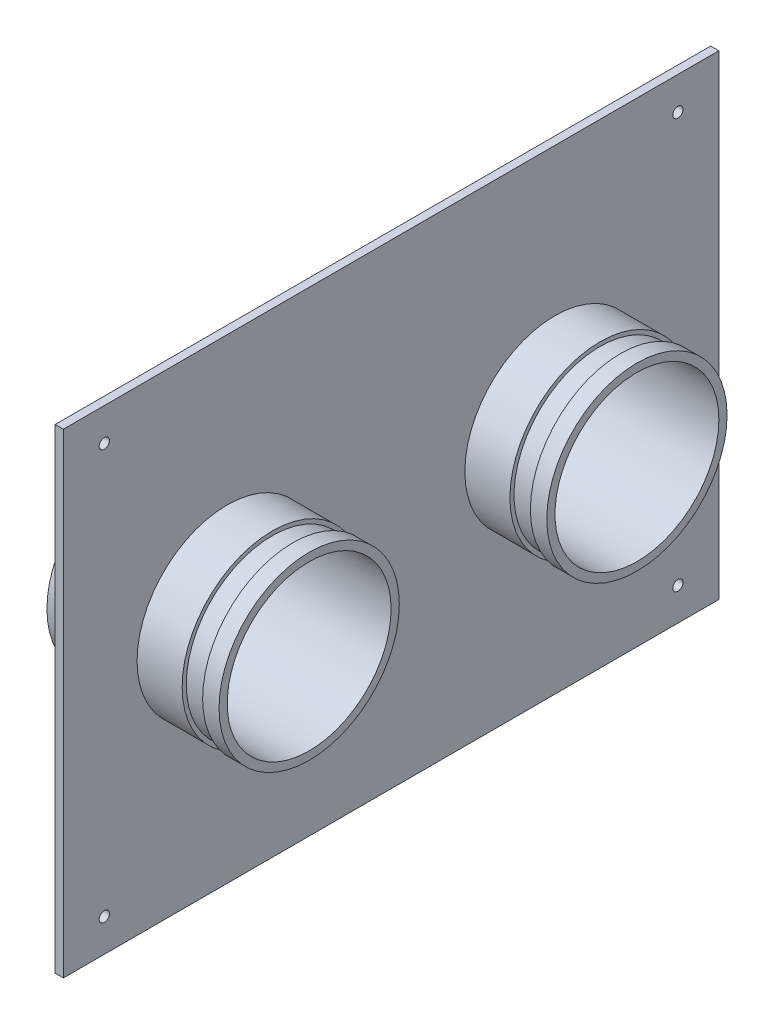
ISO-10303-21;
HEADER;
FILE_DESCRIPTION(('STEP AP214'),'2;1');
FILE_NAME('part.step','',(''),(''),'','','');
FILE_SCHEMA(('AUTOMOTIVE_DESIGN { 1 0 10303 214 1 1 1 1 }'));
ENDSEC;
DATA;
#1=APPLICATION_CONTEXT('core data for automotive mechanical design processes');
#2=APPLICATION_PROTOCOL_DEFINITION('international standard','automotive_design',2000,#1);
#3=PRODUCT_CONTEXT('',#1,'mechanical');
#4=PRODUCT('Part','Part','',(#3));
#5=PRODUCT_RELATED_PRODUCT_CATEGORY('part','',(#4));
#6=PRODUCT_DEFINITION_FORMATION('','',#4);
#7=PRODUCT_DEFINITION_CONTEXT('part definition',#1,'design');
#8=PRODUCT_DEFINITION('design','',#6,#7);
#9=PRODUCT_DEFINITION_SHAPE('','',#8);
#10=(LENGTH_UNIT() NAMED_UNIT(*) SI_UNIT(.MILLI.,.METRE.));
#11=(NAMED_UNIT(*) PLANE_ANGLE_UNIT() SI_UNIT($,.RADIAN.));
#12=(NAMED_UNIT(*) SI_UNIT($,.STERADIAN.) SOLID_ANGLE_UNIT());
#13=UNCERTAINTY_MEASURE_WITH_UNIT(LENGTH_MEASURE(1.E-05),#10,'distance_accuracy_value','');
#14=(GEOMETRIC_REPRESENTATION_CONTEXT(3) GLOBAL_UNCERTAINTY_ASSIGNED_CONTEXT((#13)) GLOBAL_UNIT_ASSIGNED_CONTEXT((#10,
#11,#12)) REPRESENTATION_CONTEXT('',''));
#15=CARTESIAN_POINT('',(0.,0.,0.));
#16=DIRECTION('',(0.,0.,1.));
#17=DIRECTION('',(1.,0.,0.));
#18=AXIS2_PLACEMENT_3D('',#15,#16,#17);
#19=CARTESIAN_POINT('',(-25.4,0.,50.8));
#20=DIRECTION('',(1.,0.,0.));
#21=DIRECTION('',(0.,0.,-1.));
#22=AXIS2_PLACEMENT_3D('',#19,#20,#21);
#23=CYLINDRICAL_SURFACE('',#22,27.94);
#24=CARTESIAN_POINT('',(2.54,0.,50.8));
#25=DIRECTION('',(1.,0.,0.));
#26=DIRECTION('',(0.,0.,-1.));
#27=AXIS2_PLACEMENT_3D('',#24,#25,#26);
#28=CIRCLE('',#27,27.94);
#29=CARTESIAN_POINT('',(2.54,0.,22.86));
#30=VERTEX_POINT('',#29);
#31=EDGE_CURVE('E98',#30,#30,#28,.T.);
#32=ORIENTED_EDGE('',*,*,#31,.T.);
#33=EDGE_LOOP('',(#32));
#34=FACE_BOUND('',#33,.T.);
#35=CARTESIAN_POINT('',(16.51,0.,50.8));
#36=DIRECTION('',(-1.,0.,0.));
#37=DIRECTION('',(0.,0.,1.));
#38=AXIS2_PLACEMENT_3D('',#35,#36,#37);
#39=CIRCLE('',#38,27.94);
#40=CARTESIAN_POINT('',(16.51,0.,78.74));
#41=VERTEX_POINT('',#40);
#42=EDGE_CURVE('E140',#41,#41,#39,.T.);
#43=ORIENTED_EDGE('',*,*,#42,.T.);
#44=EDGE_LOOP('',(#43));
#45=FACE_BOUND('',#44,.T.);
#46=ADVANCED_FACE('F36',(#34,#45),#23,.T.);
#47=CARTESIAN_POINT('',(-25.4,0.,-50.8));
#48=DIRECTION('',(1.,0.,0.));
#49=DIRECTION('',(0.,0.,-1.));
#50=AXIS2_PLACEMENT_3D('',#47,#48,#49);
#51=CYLINDRICAL_SURFACE('',#50,27.94);
#52=CARTESIAN_POINT('',(2.54,0.,-50.8));
#53=DIRECTION('',(1.,0.,0.));
#54=DIRECTION('',(0.,0.,-1.));
#55=AXIS2_PLACEMENT_3D('',#52,#53,#54);
#56=CIRCLE('',#55,27.94);
#57=CARTESIAN_POINT('',(2.54,0.,-78.74));
#58=VERTEX_POINT('',#57);
#59=EDGE_CURVE('E44',#58,#58,#56,.T.);
#60=ORIENTED_EDGE('',*,*,#59,.T.);
#61=EDGE_LOOP('',(#60));
#62=FACE_BOUND('',#61,.T.);
#63=CARTESIAN_POINT('',(16.51,0.,-50.8));
#64=DIRECTION('',(1.,0.,0.));
#65=DIRECTION('',(0.,0.,-1.));
#66=AXIS2_PLACEMENT_3D('',#63,#64,#65);
#67=CIRCLE('',#66,27.94);
#68=CARTESIAN_POINT('',(16.51,0.,-78.74));
#69=VERTEX_POINT('',#68);
#70=EDGE_CURVE('E152',#69,#69,#67,.T.);
#71=ORIENTED_EDGE('',*,*,#70,.F.);
#72=EDGE_LOOP('',(#71));
#73=FACE_BOUND('',#72,.T.);
#74=ADVANCED_FACE('F199',(#62,#73),#51,.T.);
#75=CARTESIAN_POINT('',(2.54,0.,0.));
#76=DIRECTION('',(1.,0.,0.));
#77=DIRECTION('',(0.,0.,-1.));
#78=AXIS2_PLACEMENT_3D('',#75,#76,#77);
#79=PLANE('',#78);
#80=DIRECTION('',(0.,0.,1.));
#81=VECTOR('',#80,1.);
#82=CARTESIAN_POINT('',(2.54,-73.66,101.6));
#83=LINE('',#82,#81);
#84=CARTESIAN_POINT('',(2.54,-73.66,-101.6));
#85=VERTEX_POINT('',#84);
#86=CARTESIAN_POINT('',(2.54,-73.6599999999999,101.6));
#87=VERTEX_POINT('',#86);
#88=EDGE_CURVE('E51',#85,#87,#83,.T.);
#89=ORIENTED_EDGE('',*,*,#88,.F.);
#90=DIRECTION('',(0.,1.,0.));
#91=VECTOR('',#90,1.);
#92=CARTESIAN_POINT('',(2.54,76.2,-101.6));
#93=LINE('',#92,#91);
#94=CARTESIAN_POINT('',(2.54,73.66,-101.6));
#95=VERTEX_POINT('',#94);
#96=EDGE_CURVE('E90',#85,#95,#93,.T.);
#97=ORIENTED_EDGE('',*,*,#96,.T.);
#98=DIRECTION('',(0.,0.,-1.));
#99=VECTOR('',#98,1.);
#100=CARTESIAN_POINT('',(2.54,73.66,101.6));
#101=LINE('',#100,#99);
#102=CARTESIAN_POINT('',(2.54,73.66,101.6));
#103=VERTEX_POINT('',#102);
#104=EDGE_CURVE('E319',#103,#95,#101,.T.);
#105=ORIENTED_EDGE('',*,*,#104,.F.);
#106=DIRECTION('',(0.,-1.,0.));
#107=VECTOR('',#106,1.);
#108=CARTESIAN_POINT('',(2.54,76.2,101.6));
#109=LINE('',#108,#107);
#110=EDGE_CURVE('E92',#103,#87,#109,.T.);
#111=ORIENTED_EDGE('',*,*,#110,.T.);
#112=EDGE_LOOP('',(#89,#97,#105,#111));
#113=FACE_BOUND('',#112,.T.);
#114=CARTESIAN_POINT('',(2.54,-63.5,88.9));
#115=DIRECTION('',(1.,0.,0.));
#116=DIRECTION('',(0.,0.,-1.));
#117=AXIS2_PLACEMENT_3D('',#114,#115,#116);
#118=CIRCLE('',#117,1.58749999999999);
#119=CARTESIAN_POINT('',(2.54,-63.5,87.3125));
#120=VERTEX_POINT('',#119);
#121=EDGE_CURVE('E284',#120,#120,#118,.T.);
#122=ORIENTED_EDGE('',*,*,#121,.F.);
#123=EDGE_LOOP('',(#122));
#124=FACE_BOUND('',#123,.T.);
#125=CARTESIAN_POINT('',(2.54,-63.5,-88.9));
#126=DIRECTION('',(1.,0.,0.));
#127=DIRECTION('',(0.,0.,-1.));
#128=AXIS2_PLACEMENT_3D('',#125,#126,#127);
#129=CIRCLE('',#128,1.58749999999999);
#130=CARTESIAN_POINT('',(2.54,-63.5,-90.4875));
#131=VERTEX_POINT('',#130);
#132=EDGE_CURVE('E293',#131,#131,#129,.T.);
#133=ORIENTED_EDGE('',*,*,#132,.F.);
#134=EDGE_LOOP('',(#133));
#135=FACE_BOUND('',#134,.T.);
#136=CARTESIAN_POINT('',(2.54,63.5,-88.9));
#137=DIRECTION('',(1.,0.,0.));
#138=DIRECTION('',(0.,0.,-1.));
#139=AXIS2_PLACEMENT_3D('',#136,#137,#138);
#140=CIRCLE('',#139,1.5875);
#141=CARTESIAN_POINT('',(2.54,63.5,-90.4875));
#142=VERTEX_POINT('',#141);
#143=EDGE_CURVE('E290',#142,#142,#140,.T.);
#144=ORIENTED_EDGE('',*,*,#143,.F.);
#145=EDGE_LOOP('',(#144));
#146=FACE_BOUND('',#145,.T.);
#147=CARTESIAN_POINT('',(2.54,63.5,88.9));
#148=DIRECTION('',(1.,0.,0.));
#149=DIRECTION('',(0.,0.,-1.));
#150=AXIS2_PLACEMENT_3D('',#147,#148,#149);
#151=CIRCLE('',#150,1.5875);
#152=CARTESIAN_POINT('',(2.54,63.5,87.3125));
#153=VERTEX_POINT('',#152);
#154=EDGE_CURVE('E120',#153,#153,#151,.T.);
#155=ORIENTED_EDGE('',*,*,#154,.F.);
#156=EDGE_LOOP('',(#155));
#157=FACE_BOUND('',#156,.T.);
#158=ORIENTED_EDGE('',*,*,#59,.F.);
#159=EDGE_LOOP('',(#158));
#160=FACE_BOUND('',#159,.T.);
#161=ORIENTED_EDGE('',*,*,#31,.F.);
#162=EDGE_LOOP('',(#161));
#163=FACE_BOUND('',#162,.T.);
#164=ADVANCED_FACE('F87',(#113,#124,#135,#146,#157,#160,#163),#79,.T.);
#165=CARTESIAN_POINT('',(0.,0.,0.));
#166=DIRECTION('',(1.,0.,0.));
#167=DIRECTION('',(0.,0.,-1.));
#168=AXIS2_PLACEMENT_3D('',#165,#166,#167);
#169=PLANE('',#168);
#170=CARTESIAN_POINT('',(0.,-63.5,88.9));
#171=DIRECTION('',(1.,0.,0.));
#172=DIRECTION('',(0.,0.,-1.));
#173=AXIS2_PLACEMENT_3D('',#170,#171,#172);
#174=CIRCLE('',#173,1.58749999999999);
#175=CARTESIAN_POINT('',(0.,-63.5,87.3125));
#176=VERTEX_POINT('',#175);
#177=EDGE_CURVE('E125',#176,#176,#174,.T.);
#178=ORIENTED_EDGE('',*,*,#177,.T.);
#179=EDGE_LOOP('',(#178));
#180=FACE_BOUND('',#179,.T.);
#181=CARTESIAN_POINT('',(0.,-63.5,-88.9));
#182=DIRECTION('',(1.,0.,0.));
#183=DIRECTION('',(0.,0.,-1.));
#184=AXIS2_PLACEMENT_3D('',#181,#182,#183);
#185=CIRCLE('',#184,1.58749999999999);
#186=CARTESIAN_POINT('',(0.,-63.5,-90.4875));
#187=VERTEX_POINT('',#186);
#188=EDGE_CURVE('E123',#187,#187,#185,.T.);
#189=ORIENTED_EDGE('',*,*,#188,.T.);
#190=EDGE_LOOP('',(#189));
#191=FACE_BOUND('',#190,.T.);
#192=CARTESIAN_POINT('',(0.,63.5,-88.9));
#193=DIRECTION('',(1.,0.,0.));
#194=DIRECTION('',(0.,0.,-1.));
#195=AXIS2_PLACEMENT_3D('',#192,#193,#194);
#196=CIRCLE('',#195,1.5875);
#197=CARTESIAN_POINT('',(0.,63.5,-90.4875));
#198=VERTEX_POINT('',#197);
#199=EDGE_CURVE('E119',#198,#198,#196,.T.);
#200=ORIENTED_EDGE('',*,*,#199,.T.);
#201=EDGE_LOOP('',(#200));
#202=FACE_BOUND('',#201,.T.);
#203=CARTESIAN_POINT('',(0.,63.5,88.9));
#204=DIRECTION('',(1.,0.,0.));
#205=DIRECTION('',(0.,0.,-1.));
#206=AXIS2_PLACEMENT_3D('',#203,#204,#205);
#207=CIRCLE('',#206,1.5875);
#208=CARTESIAN_POINT('',(0.,63.5,87.3125));
#209=VERTEX_POINT('',#208);
#210=EDGE_CURVE('E116',#209,#209,#207,.T.);
#211=ORIENTED_EDGE('',*,*,#210,.T.);
#212=EDGE_LOOP('',(#211));
#213=FACE_BOUND('',#212,.T.);
#214=CARTESIAN_POINT('',(0.,0.,-50.8));
#215=DIRECTION('',(1.,0.,0.));
#216=DIRECTION('',(0.,0.,-1.));
#217=AXIS2_PLACEMENT_3D('',#214,#215,#216);
#218=CIRCLE('',#217,27.94);
#219=CARTESIAN_POINT('',(0.,0.,-78.74));
#220=VERTEX_POINT('',#219);
#221=EDGE_CURVE('E111',#220,#220,#218,.T.);
#222=ORIENTED_EDGE('',*,*,#221,.T.);
#223=EDGE_LOOP('',(#222));
#224=FACE_BOUND('',#223,.T.);
#225=CARTESIAN_POINT('',(0.,0.,50.8));
#226=DIRECTION('',(1.,0.,0.));
#227=DIRECTION('',(0.,0.,-1.));
#228=AXIS2_PLACEMENT_3D('',#225,#226,#227);
#229=CIRCLE('',#228,27.94);
#230=CARTESIAN_POINT('',(0.,0.,22.86));
#231=VERTEX_POINT('',#230);
#232=EDGE_CURVE('E106',#231,#231,#229,.T.);
#233=ORIENTED_EDGE('',*,*,#232,.T.);
#234=EDGE_LOOP('',(#233));
#235=FACE_BOUND('',#234,.T.);
#236=DIRECTION('',(0.,1.,0.));
#237=VECTOR('',#236,1.);
#238=CARTESIAN_POINT('',(0.,76.2,-101.6));
#239=LINE('',#238,#237);
#240=CARTESIAN_POINT('',(0.,-73.66,-101.6));
#241=VERTEX_POINT('',#240);
#242=CARTESIAN_POINT('',(0.,73.66,-101.6));
#243=VERTEX_POINT('',#242);
#244=EDGE_CURVE('E101',#241,#243,#239,.T.);
#245=ORIENTED_EDGE('',*,*,#244,.F.);
#246=DIRECTION('',(0.,0.,1.));
#247=VECTOR('',#246,1.);
#248=CARTESIAN_POINT('',(0.,-73.66,0.));
#249=LINE('',#248,#247);
#250=CARTESIAN_POINT('',(0.,-73.66,101.6));
#251=VERTEX_POINT('',#250);
#252=EDGE_CURVE('E77',#241,#251,#249,.T.);
#253=ORIENTED_EDGE('',*,*,#252,.T.);
#254=DIRECTION('',(0.,-1.,0.));
#255=VECTOR('',#254,1.);
#256=CARTESIAN_POINT('',(0.,76.2,101.6));
#257=LINE('',#256,#255);
#258=CARTESIAN_POINT('',(0.,73.66,101.6));
#259=VERTEX_POINT('',#258);
#260=EDGE_CURVE('E96',#259,#251,#257,.T.);
#261=ORIENTED_EDGE('',*,*,#260,.F.);
#262=DIRECTION('',(0.,0.,-1.));
#263=VECTOR('',#262,1.);
#264=CARTESIAN_POINT('',(0.,73.66,0.));
#265=LINE('',#264,#263);
#266=EDGE_CURVE('E59',#259,#243,#265,.T.);
#267=ORIENTED_EDGE('',*,*,#266,.T.);
#268=EDGE_LOOP('',(#245,#253,#261,#267));
#269=FACE_BOUND('',#268,.T.);
#270=ADVANCED_FACE('F276',(#180,#191,#202,#213,#224,#235,#269),#169,.F.);
#271=CARTESIAN_POINT('',(2.54,76.2,-101.6));
#272=DIRECTION('',(0.,0.,1.));
#273=DIRECTION('',(1.,0.,0.));
#274=AXIS2_PLACEMENT_3D('',#271,#272,#273);
#275=PLANE('',#274);
#276=ORIENTED_EDGE('',*,*,#96,.F.);
#277=DIRECTION('',(1.,0.,0.));
#278=VECTOR('',#277,1.);
#279=CARTESIAN_POINT('',(-25.4,-73.66,-101.6));
#280=LINE('',#279,#278);
#281=EDGE_CURVE('E74',#241,#85,#280,.T.);
#282=ORIENTED_EDGE('',*,*,#281,.F.);
#283=ORIENTED_EDGE('',*,*,#244,.T.);
#284=DIRECTION('',(1.,0.,0.));
#285=VECTOR('',#284,1.);
#286=CARTESIAN_POINT('',(-25.4,73.66,-101.6));
#287=LINE('',#286,#285);
#288=EDGE_CURVE('E93',#243,#95,#287,.T.);
#289=ORIENTED_EDGE('',*,*,#288,.T.);
#290=EDGE_LOOP('',(#276,#282,#283,#289));
#291=FACE_BOUND('',#290,.T.);
#292=ADVANCED_FACE('F38',(#291),#275,.F.);
#293=CARTESIAN_POINT('',(2.54,76.2,101.6));
#294=DIRECTION('',(0.,0.,-1.));
#295=DIRECTION('',(0.,1.,0.));
#296=AXIS2_PLACEMENT_3D('',#293,#294,#295);
#297=PLANE('',#296);
#298=ORIENTED_EDGE('',*,*,#260,.T.);
#299=DIRECTION('',(1.,0.,0.));
#300=VECTOR('',#299,1.);
#301=CARTESIAN_POINT('',(-25.4,-73.66,101.6));
#302=LINE('',#301,#300);
#303=EDGE_CURVE('E82',#251,#87,#302,.T.);
#304=ORIENTED_EDGE('',*,*,#303,.T.);
#305=ORIENTED_EDGE('',*,*,#110,.F.);
#306=DIRECTION('',(-1.,0.,0.));
#307=VECTOR('',#306,1.);
#308=CARTESIAN_POINT('',(2.54,73.66,101.6));
#309=LINE('',#308,#307);
#310=EDGE_CURVE('E11',#103,#259,#309,.T.);
#311=ORIENTED_EDGE('',*,*,#310,.T.);
#312=EDGE_LOOP('',(#298,#304,#305,#311));
#313=FACE_BOUND('',#312,.T.);
#314=ADVANCED_FACE('F195',(#313),#297,.F.);
#315=CARTESIAN_POINT('',(-25.4,0.,50.8));
#316=DIRECTION('',(1.,0.,0.));
#317=DIRECTION('',(0.,0.,-1.));
#318=AXIS2_PLACEMENT_3D('',#315,#316,#317);
#319=CIRCLE('',#318,27.94);
#320=CARTESIAN_POINT('',(-25.4,0.,22.86));
#321=VERTEX_POINT('',#320);
#322=EDGE_CURVE('E110',#321,#321,#319,.T.);
#323=ORIENTED_EDGE('',*,*,#322,.T.);
#324=EDGE_LOOP('',(#323));
#325=FACE_BOUND('',#324,.T.);
#326=ORIENTED_EDGE('',*,*,#232,.F.);
#327=EDGE_LOOP('',(#326));
#328=FACE_BOUND('',#327,.T.);
#329=ADVANCED_FACE('F180',(#325,#328),#23,.T.);
#330=CARTESIAN_POINT('',(-25.4,0.,50.8));
#331=DIRECTION('',(1.,0.,0.));
#332=DIRECTION('',(0.,0.,-1.));
#333=AXIS2_PLACEMENT_3D('',#330,#331,#332);
#334=PLANE('',#333);
#335=CARTESIAN_POINT('',(-25.4,0.,50.8));
#336=DIRECTION('',(1.,0.,0.));
#337=DIRECTION('',(0.,0.,-1.));
#338=AXIS2_PLACEMENT_3D('',#335,#336,#337);
#339=CIRCLE('',#338,25.4);
#340=CARTESIAN_POINT('',(-25.4,0.,25.4));
#341=VERTEX_POINT('',#340);
#342=EDGE_CURVE('E175',#341,#341,#339,.T.);
#343=ORIENTED_EDGE('',*,*,#342,.T.);
#344=EDGE_LOOP('',(#343));
#345=FACE_BOUND('',#344,.T.);
#346=ORIENTED_EDGE('',*,*,#322,.F.);
#347=EDGE_LOOP('',(#346));
#348=FACE_BOUND('',#347,.T.);
#349=ADVANCED_FACE('F183',(#345,#348),#334,.F.);
#350=CARTESIAN_POINT('',(2.54,0.,50.8));
#351=DIRECTION('',(-1.,0.,0.));
#352=DIRECTION('',(0.,0.,1.));
#353=AXIS2_PLACEMENT_3D('',#350,#351,#352);
#354=CYLINDRICAL_SURFACE('',#353,25.4);
#355=ORIENTED_EDGE('',*,*,#342,.F.);
#356=EDGE_LOOP('',(#355));
#357=FACE_BOUND('',#356,.T.);
#358=CARTESIAN_POINT('',(27.94,0.,50.8));
#359=DIRECTION('',(1.,0.,0.));
#360=DIRECTION('',(0.,0.,-1.));
#361=AXIS2_PLACEMENT_3D('',#358,#359,#360);
#362=CIRCLE('',#361,25.4);
#363=CARTESIAN_POINT('',(27.94,0.,25.4));
#364=VERTEX_POINT('',#363);
#365=EDGE_CURVE('E114',#364,#364,#362,.T.);
#366=ORIENTED_EDGE('',*,*,#365,.T.);
#367=EDGE_LOOP('',(#366));
#368=FACE_BOUND('',#367,.T.);
#369=ADVANCED_FACE('F185',(#357,#368),#354,.F.);
#370=CARTESIAN_POINT('',(22.86,0.,50.8));
#371=DIRECTION('',(-1.,0.,0.));
#372=DIRECTION('',(0.,0.,1.));
#373=AXIS2_PLACEMENT_3D('',#370,#371,#372);
#374=CIRCLE('',#373,27.94);
#375=CARTESIAN_POINT('',(22.86,0.,78.74));
#376=VERTEX_POINT('',#375);
#377=EDGE_CURVE('E136',#376,#376,#374,.T.);
#378=ORIENTED_EDGE('',*,*,#377,.F.);
#379=EDGE_LOOP('',(#378));
#380=FACE_BOUND('',#379,.T.);
#381=CARTESIAN_POINT('',(27.94,0.,50.8));
#382=DIRECTION('',(1.,0.,0.));
#383=DIRECTION('',(0.,0.,-1.));
#384=AXIS2_PLACEMENT_3D('',#381,#382,#383);
#385=CIRCLE('',#384,27.94);
#386=CARTESIAN_POINT('',(27.94,0.,22.86));
#387=VERTEX_POINT('',#386);
#388=EDGE_CURVE('E172',#387,#387,#385,.T.);
#389=ORIENTED_EDGE('',*,*,#388,.F.);
#390=EDGE_LOOP('',(#389));
#391=FACE_BOUND('',#390,.T.);
#392=ADVANCED_FACE('F192',(#380,#391),#23,.T.);
#393=CARTESIAN_POINT('',(27.94,0.,50.8));
#394=DIRECTION('',(1.,0.,0.));
#395=DIRECTION('',(0.,0.,-1.));
#396=AXIS2_PLACEMENT_3D('',#393,#394,#395);
#397=PLANE('',#396);
#398=ORIENTED_EDGE('',*,*,#388,.T.);
#399=EDGE_LOOP('',(#398));
#400=FACE_BOUND('',#399,.T.);
#401=ORIENTED_EDGE('',*,*,#365,.F.);
#402=EDGE_LOOP('',(#401));
#403=FACE_BOUND('',#402,.T.);
#404=ADVANCED_FACE('F211',(#400,#403),#397,.T.);
#405=CARTESIAN_POINT('',(-25.4,0.,-50.8));
#406=DIRECTION('',(1.,0.,0.));
#407=DIRECTION('',(0.,0.,-1.));
#408=AXIS2_PLACEMENT_3D('',#405,#406,#407);
#409=CIRCLE('',#408,27.94);
#410=CARTESIAN_POINT('',(-25.4,0.,-78.74));
#411=VERTEX_POINT('',#410);
#412=EDGE_CURVE('E115',#411,#411,#409,.T.);
#413=ORIENTED_EDGE('',*,*,#412,.T.);
#414=EDGE_LOOP('',(#413));
#415=FACE_BOUND('',#414,.T.);
#416=ORIENTED_EDGE('',*,*,#221,.F.);
#417=EDGE_LOOP('',(#416));
#418=FACE_BOUND('',#417,.T.);
#419=ADVANCED_FACE('F206',(#415,#418),#51,.T.);
#420=CARTESIAN_POINT('',(-25.4,0.,-50.8));
#421=DIRECTION('',(1.,0.,0.));
#422=DIRECTION('',(0.,0.,-1.));
#423=AXIS2_PLACEMENT_3D('',#420,#421,#422);
#424=PLANE('',#423);
#425=CARTESIAN_POINT('',(-25.4,0.,-50.8));
#426=DIRECTION('',(1.,0.,0.));
#427=DIRECTION('',(0.,0.,-1.));
#428=AXIS2_PLACEMENT_3D('',#425,#426,#427);
#429=CIRCLE('',#428,25.4);
#430=CARTESIAN_POINT('',(-25.4,0.,-76.2));
#431=VERTEX_POINT('',#430);
#432=EDGE_CURVE('E163',#431,#431,#429,.T.);
#433=ORIENTED_EDGE('',*,*,#432,.T.);
#434=EDGE_LOOP('',(#433));
#435=FACE_BOUND('',#434,.T.);
#436=ORIENTED_EDGE('',*,*,#412,.F.);
#437=EDGE_LOOP('',(#436));
#438=FACE_BOUND('',#437,.T.);
#439=ADVANCED_FACE('F256',(#435,#438),#424,.F.);
#440=CARTESIAN_POINT('',(2.54,0.,-50.8));
#441=DIRECTION('',(-1.,0.,0.));
#442=DIRECTION('',(0.,0.,1.));
#443=AXIS2_PLACEMENT_3D('',#440,#441,#442);
#444=CYLINDRICAL_SURFACE('',#443,25.4);
#445=ORIENTED_EDGE('',*,*,#432,.F.);
#446=EDGE_LOOP('',(#445));
#447=FACE_BOUND('',#446,.T.);
#448=CARTESIAN_POINT('',(27.94,0.,-50.8));
#449=DIRECTION('',(1.,0.,0.));
#450=DIRECTION('',(0.,0.,-1.));
#451=AXIS2_PLACEMENT_3D('',#448,#449,#450);
#452=CIRCLE('',#451,25.4);
#453=CARTESIAN_POINT('',(27.94,0.,-76.2));
#454=VERTEX_POINT('',#453);
#455=EDGE_CURVE('E155',#454,#454,#452,.T.);
#456=ORIENTED_EDGE('',*,*,#455,.T.);
#457=EDGE_LOOP('',(#456));
#458=FACE_BOUND('',#457,.T.);
#459=ADVANCED_FACE('F258',(#447,#458),#444,.F.);
#460=CARTESIAN_POINT('',(22.86,0.,-50.8));
#461=DIRECTION('',(1.,0.,0.));
#462=DIRECTION('',(0.,0.,-1.));
#463=AXIS2_PLACEMENT_3D('',#460,#461,#462);
#464=CIRCLE('',#463,27.94);
#465=CARTESIAN_POINT('',(22.86,0.,-78.74));
#466=VERTEX_POINT('',#465);
#467=EDGE_CURVE('E149',#466,#466,#464,.T.);
#468=ORIENTED_EDGE('',*,*,#467,.T.);
#469=EDGE_LOOP('',(#468));
#470=FACE_BOUND('',#469,.T.);
#471=CARTESIAN_POINT('',(27.94,0.,-50.8));
#472=DIRECTION('',(1.,0.,0.));
#473=DIRECTION('',(0.,0.,-1.));
#474=AXIS2_PLACEMENT_3D('',#471,#472,#473);
#475=CIRCLE('',#474,27.94);
#476=CARTESIAN_POINT('',(27.94,0.,-78.74));
#477=VERTEX_POINT('',#476);
#478=EDGE_CURVE('E160',#477,#477,#475,.T.);
#479=ORIENTED_EDGE('',*,*,#478,.F.);
#480=EDGE_LOOP('',(#479));
#481=FACE_BOUND('',#480,.T.);
#482=ADVANCED_FACE('F207',(#470,#481),#51,.T.);
#483=CARTESIAN_POINT('',(27.94,0.,-50.8));
#484=DIRECTION('',(1.,0.,0.));
#485=DIRECTION('',(0.,0.,-1.));
#486=AXIS2_PLACEMENT_3D('',#483,#484,#485);
#487=PLANE('',#486);
#488=ORIENTED_EDGE('',*,*,#478,.T.);
#489=EDGE_LOOP('',(#488));
#490=FACE_BOUND('',#489,.T.);
#491=ORIENTED_EDGE('',*,*,#455,.F.);
#492=EDGE_LOOP('',(#491));
#493=FACE_BOUND('',#492,.T.);
#494=ADVANCED_FACE('F248',(#490,#493),#487,.T.);
#495=CARTESIAN_POINT('',(16.51,0.,-50.8));
#496=DIRECTION('',(1.,0.,0.));
#497=DIRECTION('',(0.,0.,-1.));
#498=AXIS2_PLACEMENT_3D('',#495,#496,#497);
#499=PLANE('',#498);
#500=CARTESIAN_POINT('',(16.51,0.,-50.8));
#501=DIRECTION('',(1.,0.,0.));
#502=DIRECTION('',(0.,0.,-1.));
#503=AXIS2_PLACEMENT_3D('',#500,#501,#502);
#504=CIRCLE('',#503,26.67);
#505=CARTESIAN_POINT('',(16.51,0.,-77.47));
#506=VERTEX_POINT('',#505);
#507=EDGE_CURVE('E146',#506,#506,#504,.T.);
#508=ORIENTED_EDGE('',*,*,#507,.F.);
#509=EDGE_LOOP('',(#508));
#510=FACE_BOUND('',#509,.T.);
#511=ORIENTED_EDGE('',*,*,#70,.T.);
#512=EDGE_LOOP('',(#511));
#513=FACE_BOUND('',#512,.T.);
#514=ADVANCED_FACE('F245',(#510,#513),#499,.T.);
#515=CARTESIAN_POINT('',(22.86,0.,-50.8));
#516=DIRECTION('',(1.,0.,0.));
#517=DIRECTION('',(0.,0.,-1.));
#518=AXIS2_PLACEMENT_3D('',#515,#516,#517);
#519=PLANE('',#518);
#520=CARTESIAN_POINT('',(22.86,0.,-50.8));
#521=DIRECTION('',(1.,0.,0.));
#522=DIRECTION('',(0.,0.,-1.));
#523=AXIS2_PLACEMENT_3D('',#520,#521,#522);
#524=CIRCLE('',#523,26.67);
#525=CARTESIAN_POINT('',(22.86,0.,-77.47));
#526=VERTEX_POINT('',#525);
#527=EDGE_CURVE('E143',#526,#526,#524,.T.);
#528=ORIENTED_EDGE('',*,*,#527,.T.);
#529=EDGE_LOOP('',(#528));
#530=FACE_BOUND('',#529,.T.);
#531=ORIENTED_EDGE('',*,*,#467,.F.);
#532=EDGE_LOOP('',(#531));
#533=FACE_BOUND('',#532,.T.);
#534=ADVANCED_FACE('F243',(#530,#533),#519,.F.);
#535=CARTESIAN_POINT('',(16.51,0.,-50.8));
#536=DIRECTION('',(1.,0.,0.));
#537=DIRECTION('',(0.,0.,-1.));
#538=AXIS2_PLACEMENT_3D('',#535,#536,#537);
#539=CYLINDRICAL_SURFACE('',#538,26.67);
#540=ORIENTED_EDGE('',*,*,#507,.T.);
#541=EDGE_LOOP('',(#540));
#542=FACE_BOUND('',#541,.T.);
#543=ORIENTED_EDGE('',*,*,#527,.F.);
#544=EDGE_LOOP('',(#543));
#545=FACE_BOUND('',#544,.T.);
#546=ADVANCED_FACE('F237',(#542,#545),#539,.T.);
#547=CARTESIAN_POINT('',(16.51,0.,50.8));
#548=DIRECTION('',(1.,0.,0.));
#549=DIRECTION('',(0.,0.,1.));
#550=AXIS2_PLACEMENT_3D('',#547,#548,#549);
#551=PLANE('',#550);
#552=ORIENTED_EDGE('',*,*,#42,.F.);
#553=EDGE_LOOP('',(#552));
#554=FACE_BOUND('',#553,.T.);
#555=CARTESIAN_POINT('',(16.51,0.,50.8));
#556=DIRECTION('',(-1.,0.,0.));
#557=DIRECTION('',(0.,0.,1.));
#558=AXIS2_PLACEMENT_3D('',#555,#556,#557);
#559=CIRCLE('',#558,26.67);
#560=CARTESIAN_POINT('',(16.51,0.,77.47));
#561=VERTEX_POINT('',#560);
#562=EDGE_CURVE('E131',#561,#561,#559,.T.);
#563=ORIENTED_EDGE('',*,*,#562,.T.);
#564=EDGE_LOOP('',(#563));
#565=FACE_BOUND('',#564,.T.);
#566=ADVANCED_FACE('F228',(#554,#565),#551,.T.);
#567=CARTESIAN_POINT('',(22.86,0.,50.8));
#568=DIRECTION('',(1.,0.,0.));
#569=DIRECTION('',(0.,0.,1.));
#570=AXIS2_PLACEMENT_3D('',#567,#568,#569);
#571=PLANE('',#570);
#572=ORIENTED_EDGE('',*,*,#377,.T.);
#573=EDGE_LOOP('',(#572));
#574=FACE_BOUND('',#573,.T.);
#575=CARTESIAN_POINT('',(22.86,0.,50.8));
#576=DIRECTION('',(-1.,0.,0.));
#577=DIRECTION('',(0.,0.,1.));
#578=AXIS2_PLACEMENT_3D('',#575,#576,#577);
#579=CIRCLE('',#578,26.67);
#580=CARTESIAN_POINT('',(22.86,0.,77.47));
#581=VERTEX_POINT('',#580);
#582=EDGE_CURVE('E127',#581,#581,#579,.T.);
#583=ORIENTED_EDGE('',*,*,#582,.F.);
#584=EDGE_LOOP('',(#583));
#585=FACE_BOUND('',#584,.T.);
#586=ADVANCED_FACE('F224',(#574,#585),#571,.F.);
#587=CARTESIAN_POINT('',(16.51,0.,50.8));
#588=DIRECTION('',(1.,0.,0.));
#589=DIRECTION('',(0.,0.,-1.));
#590=AXIS2_PLACEMENT_3D('',#587,#588,#589);
#591=CYLINDRICAL_SURFACE('',#590,26.67);
#592=ORIENTED_EDGE('',*,*,#562,.F.);
#593=EDGE_LOOP('',(#592));
#594=FACE_BOUND('',#593,.T.);
#595=ORIENTED_EDGE('',*,*,#582,.T.);
#596=EDGE_LOOP('',(#595));
#597=FACE_BOUND('',#596,.T.);
#598=ADVANCED_FACE('F227',(#594,#597),#591,.T.);
#599=CARTESIAN_POINT('',(-25.4,63.5,88.9));
#600=DIRECTION('',(1.,0.,0.));
#601=DIRECTION('',(0.,0.,-1.));
#602=AXIS2_PLACEMENT_3D('',#599,#600,#601);
#603=CYLINDRICAL_SURFACE('',#602,1.5875);
#604=ORIENTED_EDGE('',*,*,#154,.T.);
#605=EDGE_LOOP('',(#604));
#606=FACE_BOUND('',#605,.T.);
#607=ORIENTED_EDGE('',*,*,#210,.F.);
#608=EDGE_LOOP('',(#607));
#609=FACE_BOUND('',#608,.T.);
#610=ADVANCED_FACE('F234',(#606,#609),#603,.F.);
#611=CARTESIAN_POINT('',(-25.4,63.5,-88.9));
#612=DIRECTION('',(1.,0.,0.));
#613=DIRECTION('',(0.,0.,-1.));
#614=AXIS2_PLACEMENT_3D('',#611,#612,#613);
#615=CYLINDRICAL_SURFACE('',#614,1.5875);
#616=ORIENTED_EDGE('',*,*,#143,.T.);
#617=EDGE_LOOP('',(#616));
#618=FACE_BOUND('',#617,.T.);
#619=ORIENTED_EDGE('',*,*,#199,.F.);
#620=EDGE_LOOP('',(#619));
#621=FACE_BOUND('',#620,.T.);
#622=ADVANCED_FACE('F332',(#618,#621),#615,.F.);
#623=CARTESIAN_POINT('',(-25.4,-63.5,-88.9));
#624=DIRECTION('',(1.,0.,0.));
#625=DIRECTION('',(0.,0.,-1.));
#626=AXIS2_PLACEMENT_3D('',#623,#624,#625);
#627=CYLINDRICAL_SURFACE('',#626,1.58749999999999);
#628=ORIENTED_EDGE('',*,*,#132,.T.);
#629=EDGE_LOOP('',(#628));
#630=FACE_BOUND('',#629,.T.);
#631=ORIENTED_EDGE('',*,*,#188,.F.);
#632=EDGE_LOOP('',(#631));
#633=FACE_BOUND('',#632,.T.);
#634=ADVANCED_FACE('F328',(#630,#633),#627,.F.);
#635=CARTESIAN_POINT('',(-25.4,-63.5,88.9));
#636=DIRECTION('',(1.,0.,0.));
#637=DIRECTION('',(0.,0.,-1.));
#638=AXIS2_PLACEMENT_3D('',#635,#636,#637);
#639=CYLINDRICAL_SURFACE('',#638,1.58749999999999);
#640=ORIENTED_EDGE('',*,*,#121,.T.);
#641=EDGE_LOOP('',(#640));
#642=FACE_BOUND('',#641,.T.);
#643=ORIENTED_EDGE('',*,*,#177,.F.);
#644=EDGE_LOOP('',(#643));
#645=FACE_BOUND('',#644,.T.);
#646=ADVANCED_FACE('F321',(#642,#645),#639,.F.);
#647=CARTESIAN_POINT('',(-25.4,73.66,101.6));
#648=DIRECTION('',(0.,-1.,0.));
#649=DIRECTION('',(0.,0.,-1.));
#650=AXIS2_PLACEMENT_3D('',#647,#648,#649);
#651=PLANE('',#650);
#652=ORIENTED_EDGE('',*,*,#310,.F.);
#653=ORIENTED_EDGE('',*,*,#104,.T.);
#654=ORIENTED_EDGE('',*,*,#288,.F.);
#655=ORIENTED_EDGE('',*,*,#266,.F.);
#656=EDGE_LOOP('',(#652,#653,#654,#655));
#657=FACE_BOUND('',#656,.T.);
#658=ADVANCED_FACE('F318',(#657),#651,.F.);
#659=CARTESIAN_POINT('',(-25.4,-73.66,101.6));
#660=DIRECTION('',(0.,1.,0.));
#661=DIRECTION('',(0.,0.,1.));
#662=AXIS2_PLACEMENT_3D('',#659,#660,#661);
#663=PLANE('',#662);
#664=ORIENTED_EDGE('',*,*,#281,.T.);
#665=ORIENTED_EDGE('',*,*,#88,.T.);
#666=ORIENTED_EDGE('',*,*,#303,.F.);
#667=ORIENTED_EDGE('',*,*,#252,.F.);
#668=EDGE_LOOP('',(#664,#665,#666,#667));
#669=FACE_BOUND('',#668,.T.);
#670=ADVANCED_FACE('F75',(#669),#663,.F.);
#671=CLOSED_SHELL('',(#46,#74,#164,#270,#292,#314,#329,#349,#369,#392,#404,#419,#439,#459,#482,
#494,#514,#534,#546,#566,#586,#598,#610,#622,#634,#646,#658,#670));
#672=MANIFOLD_SOLID_BREP('B2',#671);
#673=ADVANCED_BREP_SHAPE_REPRESENTATION('',(#18,#672),#14);
#674=SHAPE_DEFINITION_REPRESENTATION(#9,#673);
ENDSEC;
END-ISO-10303-21;
